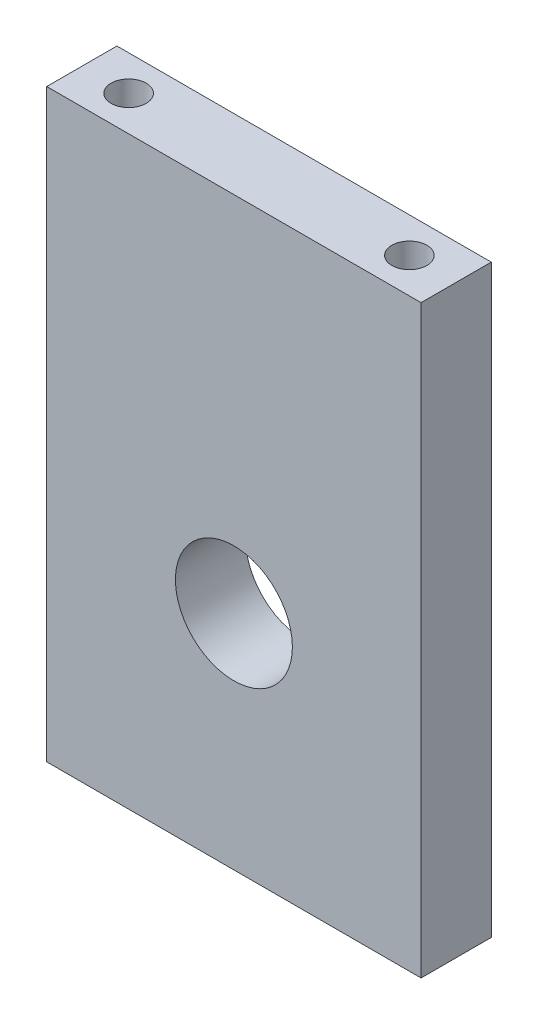
ISO-10303-21;
HEADER;
FILE_DESCRIPTION(('STEP AP214'),'2;1');
FILE_NAME('part.step','',(''),(''),'','','');
FILE_SCHEMA(('AUTOMOTIVE_DESIGN { 1 0 10303 214 1 1 1 1 }'));
ENDSEC;
DATA;
#1=APPLICATION_CONTEXT('core data for automotive mechanical design processes');
#2=APPLICATION_PROTOCOL_DEFINITION('international standard','automotive_design',2000,#1);
#3=PRODUCT_CONTEXT('',#1,'mechanical');
#4=PRODUCT('Part','Part','',(#3));
#5=PRODUCT_RELATED_PRODUCT_CATEGORY('part','',(#4));
#6=PRODUCT_DEFINITION_FORMATION('','',#4);
#7=PRODUCT_DEFINITION_CONTEXT('part definition',#1,'design');
#8=PRODUCT_DEFINITION('design','',#6,#7);
#9=PRODUCT_DEFINITION_SHAPE('','',#8);
#10=(LENGTH_UNIT() NAMED_UNIT(*) SI_UNIT(.MILLI.,.METRE.));
#11=(NAMED_UNIT(*) PLANE_ANGLE_UNIT() SI_UNIT($,.RADIAN.));
#12=(NAMED_UNIT(*) SI_UNIT($,.STERADIAN.) SOLID_ANGLE_UNIT());
#13=UNCERTAINTY_MEASURE_WITH_UNIT(LENGTH_MEASURE(1.E-05),#10,'distance_accuracy_value','');
#14=(GEOMETRIC_REPRESENTATION_CONTEXT(3) GLOBAL_UNCERTAINTY_ASSIGNED_CONTEXT((#13)) GLOBAL_UNIT_ASSIGNED_CONTEXT((#10,
#11,#12)) REPRESENTATION_CONTEXT('',''));
#15=CARTESIAN_POINT('',(0.,0.,0.));
#16=DIRECTION('',(0.,0.,1.));
#17=DIRECTION('',(1.,0.,0.));
#18=AXIS2_PLACEMENT_3D('',#15,#16,#17);
#19=CARTESIAN_POINT('',(-16.,31.,6.));
#20=DIRECTION('',(0.,1.,0.));
#21=DIRECTION('',(0.,0.,1.));
#22=AXIS2_PLACEMENT_3D('',#19,#20,#21);
#23=PLANE('',#22);
#24=CARTESIAN_POINT('',(-12.,31.,3.));
#25=DIRECTION('',(0.,1.,0.));
#26=DIRECTION('',(0.,0.,1.));
#27=AXIS2_PLACEMENT_3D('',#24,#25,#26);
#28=CIRCLE('',#27,1.5);
#29=CARTESIAN_POINT('',(-12.,31.,4.5));
#30=VERTEX_POINT('',#29);
#31=EDGE_CURVE('E166',#30,#30,#28,.T.);
#32=ORIENTED_EDGE('',*,*,#31,.F.);
#33=EDGE_LOOP('',(#32));
#34=FACE_BOUND('',#33,.T.);
#35=DIRECTION('',(1.,0.,0.));
#36=VECTOR('',#35,1.);
#37=CARTESIAN_POINT('',(-16.,31.,0.));
#38=LINE('',#37,#36);
#39=CARTESIAN_POINT('',(-16.,31.,0.));
#40=VERTEX_POINT('',#39);
#41=CARTESIAN_POINT('',(16.,31.,0.));
#42=VERTEX_POINT('',#41);
#43=EDGE_CURVE('E130',#40,#42,#38,.T.);
#44=ORIENTED_EDGE('',*,*,#43,.F.);
#45=DIRECTION('',(0.,0.,-1.));
#46=VECTOR('',#45,1.);
#47=CARTESIAN_POINT('',(-16.,31.,6.));
#48=LINE('',#47,#46);
#49=CARTESIAN_POINT('',(-16.,31.,6.));
#50=VERTEX_POINT('',#49);
#51=EDGE_CURVE('E45',#50,#40,#48,.T.);
#52=ORIENTED_EDGE('',*,*,#51,.F.);
#53=DIRECTION('',(1.,0.,0.));
#54=VECTOR('',#53,1.);
#55=CARTESIAN_POINT('',(-16.,31.,6.));
#56=LINE('',#55,#54);
#57=CARTESIAN_POINT('',(16.,31.,6.));
#58=VERTEX_POINT('',#57);
#59=EDGE_CURVE('E143',#50,#58,#56,.T.);
#60=ORIENTED_EDGE('',*,*,#59,.T.);
#61=DIRECTION('',(0.,0.,-1.));
#62=VECTOR('',#61,1.);
#63=CARTESIAN_POINT('',(16.,31.,6.));
#64=LINE('',#63,#62);
#65=EDGE_CURVE('E146',#58,#42,#64,.T.);
#66=ORIENTED_EDGE('',*,*,#65,.T.);
#67=EDGE_LOOP('',(#44,#52,#60,#66));
#68=FACE_BOUND('',#67,.T.);
#69=CARTESIAN_POINT('',(12.,31.,3.));
#70=DIRECTION('',(0.,1.,0.));
#71=DIRECTION('',(0.,0.,1.));
#72=AXIS2_PLACEMENT_3D('',#69,#70,#71);
#73=CIRCLE('',#72,1.5);
#74=CARTESIAN_POINT('',(12.,31.,4.5));
#75=VERTEX_POINT('',#74);
#76=EDGE_CURVE('E177',#75,#75,#73,.T.);
#77=ORIENTED_EDGE('',*,*,#76,.F.);
#78=EDGE_LOOP('',(#77));
#79=FACE_BOUND('',#78,.T.);
#80=ADVANCED_FACE('F30',(#34,#68,#79),#23,.T.);
#81=CARTESIAN_POINT('',(-16.,-19.,6.));
#82=DIRECTION('',(0.,0.,-1.));
#83=DIRECTION('',(-1.,0.,0.));
#84=AXIS2_PLACEMENT_3D('',#81,#82,#83);
#85=PLANE('',#84);
#86=DIRECTION('',(0.,-1.,0.));
#87=VECTOR('',#86,1.);
#88=CARTESIAN_POINT('',(-16.,31.,6.));
#89=LINE('',#88,#87);
#90=CARTESIAN_POINT('',(-16.,-19.,6.));
#91=VERTEX_POINT('',#90);
#92=EDGE_CURVE('E138',#50,#91,#89,.T.);
#93=ORIENTED_EDGE('',*,*,#92,.T.);
#94=DIRECTION('',(-1.,0.,0.));
#95=VECTOR('',#94,1.);
#96=CARTESIAN_POINT('',(16.,-19.,6.));
#97=LINE('',#96,#95);
#98=CARTESIAN_POINT('',(16.,-19.,6.));
#99=VERTEX_POINT('',#98);
#100=EDGE_CURVE('E140',#99,#91,#97,.T.);
#101=ORIENTED_EDGE('',*,*,#100,.F.);
#102=DIRECTION('',(0.,1.,0.));
#103=VECTOR('',#102,1.);
#104=CARTESIAN_POINT('',(16.,-19.,6.));
#105=LINE('',#104,#103);
#106=EDGE_CURVE('E53',#99,#58,#105,.T.);
#107=ORIENTED_EDGE('',*,*,#106,.T.);
#108=ORIENTED_EDGE('',*,*,#59,.F.);
#109=EDGE_LOOP('',(#93,#101,#107,#108));
#110=FACE_BOUND('',#109,.T.);
#111=CARTESIAN_POINT('',(0.,0.,6.));
#112=DIRECTION('',(0.,0.,1.));
#113=DIRECTION('',(1.,0.,0.));
#114=AXIS2_PLACEMENT_3D('',#111,#112,#113);
#115=CIRCLE('',#114,5.);
#116=CARTESIAN_POINT('',(5.,0.,6.));
#117=VERTEX_POINT('',#116);
#118=EDGE_CURVE('E132',#117,#117,#115,.T.);
#119=ORIENTED_EDGE('',*,*,#118,.F.);
#120=EDGE_LOOP('',(#119));
#121=FACE_BOUND('',#120,.T.);
#122=ADVANCED_FACE('F95',(#110,#121),#85,.F.);
#123=CARTESIAN_POINT('',(-16.,-19.,0.));
#124=DIRECTION('',(0.,0.,-1.));
#125=DIRECTION('',(-1.,0.,0.));
#126=AXIS2_PLACEMENT_3D('',#123,#124,#125);
#127=PLANE('',#126);
#128=DIRECTION('',(0.,-1.,0.));
#129=VECTOR('',#128,1.);
#130=CARTESIAN_POINT('',(-16.,31.,0.));
#131=LINE('',#130,#129);
#132=CARTESIAN_POINT('',(-16.,-19.,0.));
#133=VERTEX_POINT('',#132);
#134=EDGE_CURVE('E127',#40,#133,#131,.T.);
#135=ORIENTED_EDGE('',*,*,#134,.F.);
#136=ORIENTED_EDGE('',*,*,#43,.T.);
#137=DIRECTION('',(0.,1.,0.));
#138=VECTOR('',#137,1.);
#139=CARTESIAN_POINT('',(16.,-19.,0.));
#140=LINE('',#139,#138);
#141=CARTESIAN_POINT('',(16.,-19.,0.));
#142=VERTEX_POINT('',#141);
#143=EDGE_CURVE('E126',#142,#42,#140,.T.);
#144=ORIENTED_EDGE('',*,*,#143,.F.);
#145=DIRECTION('',(-1.,0.,0.));
#146=VECTOR('',#145,1.);
#147=CARTESIAN_POINT('',(16.,-19.,0.));
#148=LINE('',#147,#146);
#149=EDGE_CURVE('E119',#142,#133,#148,.T.);
#150=ORIENTED_EDGE('',*,*,#149,.T.);
#151=EDGE_LOOP('',(#135,#136,#144,#150));
#152=FACE_BOUND('',#151,.T.);
#153=CARTESIAN_POINT('',(0.,0.,0.));
#154=DIRECTION('',(0.,0.,1.));
#155=DIRECTION('',(1.,0.,0.));
#156=AXIS2_PLACEMENT_3D('',#153,#154,#155);
#157=CIRCLE('',#156,5.);
#158=CARTESIAN_POINT('',(5.,0.,0.));
#159=VERTEX_POINT('',#158);
#160=EDGE_CURVE('E153',#159,#159,#157,.T.);
#161=ORIENTED_EDGE('',*,*,#160,.T.);
#162=EDGE_LOOP('',(#161));
#163=FACE_BOUND('',#162,.T.);
#164=ADVANCED_FACE('F101',(#152,#163),#127,.T.);
#165=CARTESIAN_POINT('',(-16.,31.,6.));
#166=DIRECTION('',(1.,0.,0.));
#167=DIRECTION('',(0.,0.,-1.));
#168=AXIS2_PLACEMENT_3D('',#165,#166,#167);
#169=PLANE('',#168);
#170=ORIENTED_EDGE('',*,*,#134,.T.);
#171=DIRECTION('',(0.,0.,-1.));
#172=VECTOR('',#171,1.);
#173=CARTESIAN_POINT('',(-16.,-19.,6.));
#174=LINE('',#173,#172);
#175=EDGE_CURVE('E11',#91,#133,#174,.T.);
#176=ORIENTED_EDGE('',*,*,#175,.F.);
#177=ORIENTED_EDGE('',*,*,#92,.F.);
#178=ORIENTED_EDGE('',*,*,#51,.T.);
#179=EDGE_LOOP('',(#170,#176,#177,#178));
#180=FACE_BOUND('',#179,.T.);
#181=ADVANCED_FACE('F32',(#180),#169,.F.);
#182=CARTESIAN_POINT('',(16.,-19.,6.));
#183=DIRECTION('',(0.,-1.,0.));
#184=DIRECTION('',(0.,0.,-1.));
#185=AXIS2_PLACEMENT_3D('',#182,#183,#184);
#186=PLANE('',#185);
#187=ORIENTED_EDGE('',*,*,#149,.F.);
#188=DIRECTION('',(0.,0.,-1.));
#189=VECTOR('',#188,1.);
#190=CARTESIAN_POINT('',(16.,-19.,6.));
#191=LINE('',#190,#189);
#192=EDGE_CURVE('E38',#99,#142,#191,.T.);
#193=ORIENTED_EDGE('',*,*,#192,.F.);
#194=ORIENTED_EDGE('',*,*,#100,.T.);
#195=ORIENTED_EDGE('',*,*,#175,.T.);
#196=EDGE_LOOP('',(#187,#193,#194,#195));
#197=FACE_BOUND('',#196,.T.);
#198=ADVANCED_FACE('F109',(#197),#186,.T.);
#199=CARTESIAN_POINT('',(16.,-19.,6.));
#200=DIRECTION('',(-1.,0.,0.));
#201=DIRECTION('',(0.,-1.,0.));
#202=AXIS2_PLACEMENT_3D('',#199,#200,#201);
#203=PLANE('',#202);
#204=ORIENTED_EDGE('',*,*,#143,.T.);
#205=ORIENTED_EDGE('',*,*,#65,.F.);
#206=ORIENTED_EDGE('',*,*,#106,.F.);
#207=ORIENTED_EDGE('',*,*,#192,.T.);
#208=EDGE_LOOP('',(#204,#205,#206,#207));
#209=FACE_BOUND('',#208,.T.);
#210=ADVANCED_FACE('F106',(#209),#203,.F.);
#211=CARTESIAN_POINT('',(0.,0.,6.));
#212=DIRECTION('',(0.,0.,-1.));
#213=DIRECTION('',(-1.,0.,0.));
#214=AXIS2_PLACEMENT_3D('',#211,#212,#213);
#215=CYLINDRICAL_SURFACE('',#214,5.);
#216=ORIENTED_EDGE('',*,*,#118,.T.);
#217=EDGE_LOOP('',(#216));
#218=FACE_BOUND('',#217,.T.);
#219=ORIENTED_EDGE('',*,*,#160,.F.);
#220=EDGE_LOOP('',(#219));
#221=FACE_BOUND('',#220,.T.);
#222=ADVANCED_FACE('F108',(#218,#221),#215,.F.);
#223=CARTESIAN_POINT('',(-12.,19.5493545357293,3.));
#224=DIRECTION('',(0.,1.,0.));
#225=DIRECTION('',(0.,0.,1.));
#226=AXIS2_PLACEMENT_3D('',#223,#224,#225);
#227=CONICAL_SURFACE('',#226,0.,1.02974425867666);
#228=CARTESIAN_POINT('',(-12.,20.,3.));
#229=DIRECTION('',(0.,1.,0.));
#230=DIRECTION('',(0.,0.,1.));
#231=AXIS2_PLACEMENT_3D('',#228,#229,#230);
#232=CIRCLE('',#231,0.750000000000001);
#233=CARTESIAN_POINT('',(-12.,20.,3.75));
#234=VERTEX_POINT('',#233);
#235=EDGE_CURVE('E155',#234,#234,#232,.T.);
#236=ORIENTED_EDGE('',*,*,#235,.T.);
#237=EDGE_LOOP('',(#236));
#238=FACE_BOUND('',#237,.T.);
#239=CARTESIAN_POINT('',(-12.,19.5493545357293,3.));
#240=VERTEX_POINT('',#239);
#241=VERTEX_LOOP('',#240);
#242=FACE_BOUND('',#241,.T.);
#243=ADVANCED_FACE('F240',(#238,#242),#227,.F.);
#244=CARTESIAN_POINT('',(-12.,31.,3.));
#245=DIRECTION('',(0.,1.,0.));
#246=DIRECTION('',(0.,0.,1.));
#247=AXIS2_PLACEMENT_3D('',#244,#245,#246);
#248=CYLINDRICAL_SURFACE('',#247,0.750000000000001);
#249=CARTESIAN_POINT('',(-12.,23.,3.));
#250=DIRECTION('',(0.,1.,0.));
#251=DIRECTION('',(0.,0.,1.));
#252=AXIS2_PLACEMENT_3D('',#249,#250,#251);
#253=CIRCLE('',#252,0.750000000000001);
#254=CARTESIAN_POINT('',(-12.,23.,3.75));
#255=VERTEX_POINT('',#254);
#256=EDGE_CURVE('E160',#255,#255,#253,.T.);
#257=ORIENTED_EDGE('',*,*,#256,.T.);
#258=EDGE_LOOP('',(#257));
#259=FACE_BOUND('',#258,.T.);
#260=ORIENTED_EDGE('',*,*,#235,.F.);
#261=EDGE_LOOP('',(#260));
#262=FACE_BOUND('',#261,.T.);
#263=ADVANCED_FACE('F231',(#259,#262),#248,.F.);
#264=CARTESIAN_POINT('',(-11.25,23.,3.));
#265=DIRECTION('',(0.,1.,0.));
#266=DIRECTION('',(0.,0.,1.));
#267=AXIS2_PLACEMENT_3D('',#264,#265,#266);
#268=PLANE('',#267);
#269=CARTESIAN_POINT('',(-12.,23.,3.));
#270=DIRECTION('',(0.,1.,0.));
#271=DIRECTION('',(0.,0.,1.));
#272=AXIS2_PLACEMENT_3D('',#269,#270,#271);
#273=CIRCLE('',#272,1.5);
#274=CARTESIAN_POINT('',(-12.,23.,4.5));
#275=VERTEX_POINT('',#274);
#276=EDGE_CURVE('E163',#275,#275,#273,.T.);
#277=ORIENTED_EDGE('',*,*,#276,.T.);
#278=EDGE_LOOP('',(#277));
#279=FACE_BOUND('',#278,.T.);
#280=ORIENTED_EDGE('',*,*,#256,.F.);
#281=EDGE_LOOP('',(#280));
#282=FACE_BOUND('',#281,.T.);
#283=ADVANCED_FACE('F90',(#279,#282),#268,.T.);
#284=CARTESIAN_POINT('',(-12.,31.,3.));
#285=DIRECTION('',(0.,1.,0.));
#286=DIRECTION('',(0.,0.,1.));
#287=AXIS2_PLACEMENT_3D('',#284,#285,#286);
#288=CYLINDRICAL_SURFACE('',#287,1.5);
#289=ORIENTED_EDGE('',*,*,#31,.T.);
#290=EDGE_LOOP('',(#289));
#291=FACE_BOUND('',#290,.T.);
#292=ORIENTED_EDGE('',*,*,#276,.F.);
#293=EDGE_LOOP('',(#292));
#294=FACE_BOUND('',#293,.T.);
#295=ADVANCED_FACE('F80',(#291,#294),#288,.F.);
#296=CARTESIAN_POINT('',(12.,19.5493545357293,3.));
#297=DIRECTION('',(0.,1.,0.));
#298=DIRECTION('',(0.,0.,1.));
#299=AXIS2_PLACEMENT_3D('',#296,#297,#298);
#300=CONICAL_SURFACE('',#299,0.,1.02974425867666);
#301=CARTESIAN_POINT('',(12.,20.,3.));
#302=DIRECTION('',(0.,1.,0.));
#303=DIRECTION('',(0.,0.,1.));
#304=AXIS2_PLACEMENT_3D('',#301,#302,#303);
#305=CIRCLE('',#304,0.750000000000001);
#306=CARTESIAN_POINT('',(12.,20.,3.75));
#307=VERTEX_POINT('',#306);
#308=EDGE_CURVE('E169',#307,#307,#305,.T.);
#309=ORIENTED_EDGE('',*,*,#308,.T.);
#310=EDGE_LOOP('',(#309));
#311=FACE_BOUND('',#310,.T.);
#312=CARTESIAN_POINT('',(12.,19.5493545357293,3.));
#313=VERTEX_POINT('',#312);
#314=VERTEX_LOOP('',#313);
#315=FACE_BOUND('',#314,.T.);
#316=ADVANCED_FACE('F77',(#311,#315),#300,.F.);
#317=CARTESIAN_POINT('',(12.,31.,3.));
#318=DIRECTION('',(0.,1.,0.));
#319=DIRECTION('',(0.,0.,1.));
#320=AXIS2_PLACEMENT_3D('',#317,#318,#319);
#321=CYLINDRICAL_SURFACE('',#320,0.750000000000001);
#322=CARTESIAN_POINT('',(12.,23.,3.));
#323=DIRECTION('',(0.,1.,0.));
#324=DIRECTION('',(0.,0.,1.));
#325=AXIS2_PLACEMENT_3D('',#322,#323,#324);
#326=CIRCLE('',#325,0.750000000000001);
#327=CARTESIAN_POINT('',(12.,23.,3.75));
#328=VERTEX_POINT('',#327);
#329=EDGE_CURVE('E171',#328,#328,#326,.T.);
#330=ORIENTED_EDGE('',*,*,#329,.T.);
#331=EDGE_LOOP('',(#330));
#332=FACE_BOUND('',#331,.T.);
#333=ORIENTED_EDGE('',*,*,#308,.F.);
#334=EDGE_LOOP('',(#333));
#335=FACE_BOUND('',#334,.T.);
#336=ADVANCED_FACE('F79',(#332,#335),#321,.F.);
#337=CARTESIAN_POINT('',(12.75,23.,3.));
#338=DIRECTION('',(0.,1.,0.));
#339=DIRECTION('',(0.,0.,1.));
#340=AXIS2_PLACEMENT_3D('',#337,#338,#339);
#341=PLANE('',#340);
#342=CARTESIAN_POINT('',(12.,23.,3.));
#343=DIRECTION('',(0.,1.,0.));
#344=DIRECTION('',(0.,0.,1.));
#345=AXIS2_PLACEMENT_3D('',#342,#343,#344);
#346=CIRCLE('',#345,1.5);
#347=CARTESIAN_POINT('',(12.,23.,4.5));
#348=VERTEX_POINT('',#347);
#349=EDGE_CURVE('E174',#348,#348,#346,.T.);
#350=ORIENTED_EDGE('',*,*,#349,.T.);
#351=EDGE_LOOP('',(#350));
#352=FACE_BOUND('',#351,.T.);
#353=ORIENTED_EDGE('',*,*,#329,.F.);
#354=EDGE_LOOP('',(#353));
#355=FACE_BOUND('',#354,.T.);
#356=ADVANCED_FACE('F87',(#352,#355),#341,.T.);
#357=CARTESIAN_POINT('',(12.,31.,3.));
#358=DIRECTION('',(0.,1.,0.));
#359=DIRECTION('',(0.,0.,1.));
#360=AXIS2_PLACEMENT_3D('',#357,#358,#359);
#361=CYLINDRICAL_SURFACE('',#360,1.5);
#362=ORIENTED_EDGE('',*,*,#76,.T.);
#363=EDGE_LOOP('',(#362));
#364=FACE_BOUND('',#363,.T.);
#365=ORIENTED_EDGE('',*,*,#349,.F.);
#366=EDGE_LOOP('',(#365));
#367=FACE_BOUND('',#366,.T.);
#368=ADVANCED_FACE('F181',(#364,#367),#361,.F.);
#369=CLOSED_SHELL('',(#80,#122,#164,#181,#198,#210,#222,#243,#263,#283,#295,#316,#336,#356,#368));
#370=MANIFOLD_SOLID_BREP('B2',#369);
#371=ADVANCED_BREP_SHAPE_REPRESENTATION('',(#18,#370),#14);
#372=SHAPE_DEFINITION_REPRESENTATION(#9,#371);
ENDSEC;
END-ISO-10303-21;
